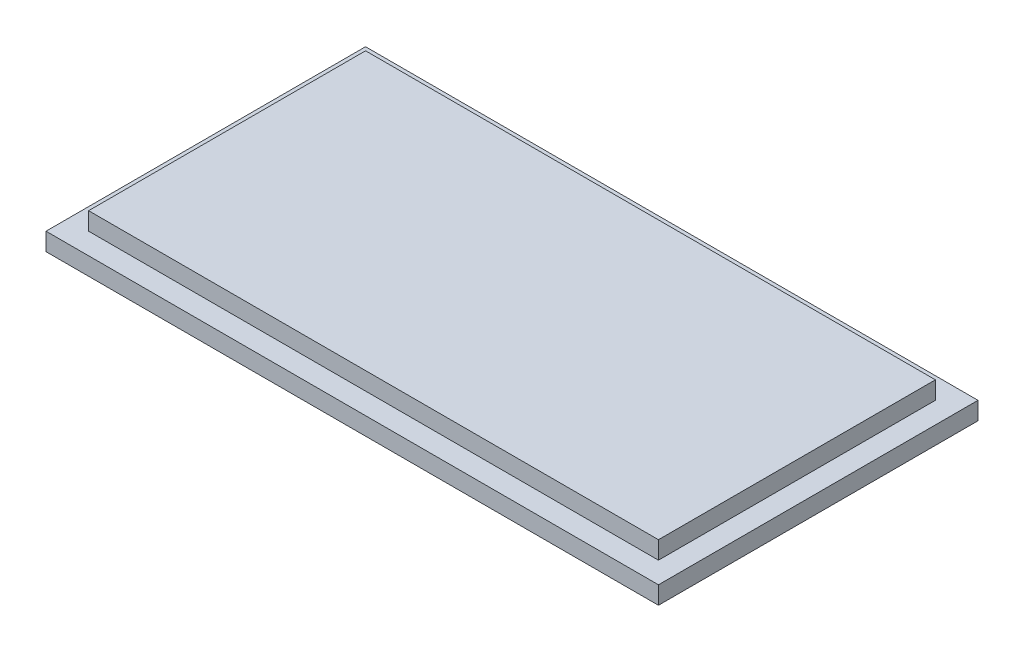
ISO-10303-21;
HEADER;
FILE_DESCRIPTION(('STEP AP214'),'2;1');
FILE_NAME('part.step','',(''),(''),'','','');
FILE_SCHEMA(('AUTOMOTIVE_DESIGN { 1 0 10303 214 1 1 1 1 }'));
ENDSEC;
DATA;
#1=APPLICATION_CONTEXT('core data for automotive mechanical design processes');
#2=APPLICATION_PROTOCOL_DEFINITION('international standard','automotive_design',2000,#1);
#3=PRODUCT_CONTEXT('',#1,'mechanical');
#4=PRODUCT('Part','Part','',(#3));
#5=PRODUCT_RELATED_PRODUCT_CATEGORY('part','',(#4));
#6=PRODUCT_DEFINITION_FORMATION('','',#4);
#7=PRODUCT_DEFINITION_CONTEXT('part definition',#1,'design');
#8=PRODUCT_DEFINITION('design','',#6,#7);
#9=PRODUCT_DEFINITION_SHAPE('','',#8);
#10=(LENGTH_UNIT() NAMED_UNIT(*) SI_UNIT(.MILLI.,.METRE.));
#11=(NAMED_UNIT(*) PLANE_ANGLE_UNIT() SI_UNIT($,.RADIAN.));
#12=(NAMED_UNIT(*) SI_UNIT($,.STERADIAN.) SOLID_ANGLE_UNIT());
#13=UNCERTAINTY_MEASURE_WITH_UNIT(LENGTH_MEASURE(1.E-05),#10,'distance_accuracy_value','');
#14=(GEOMETRIC_REPRESENTATION_CONTEXT(3) GLOBAL_UNCERTAINTY_ASSIGNED_CONTEXT((#13)) GLOBAL_UNIT_ASSIGNED_CONTEXT((#10,
#11,#12)) REPRESENTATION_CONTEXT('',''));
#15=CARTESIAN_POINT('',(0.,0.,0.));
#16=DIRECTION('',(0.,0.,1.));
#17=DIRECTION('',(1.,0.,0.));
#18=AXIS2_PLACEMENT_3D('',#15,#16,#17);
#19=CARTESIAN_POINT('',(17.25,1.,-9.));
#20=DIRECTION('',(-1.,0.,0.));
#21=DIRECTION('',(0.,0.,1.));
#22=AXIS2_PLACEMENT_3D('',#19,#20,#21);
#23=PLANE('',#22);
#24=DIRECTION('',(0.,0.,-1.));
#25=VECTOR('',#24,1.);
#26=CARTESIAN_POINT('',(17.25,0.,-9.));
#27=LINE('',#26,#25);
#28=CARTESIAN_POINT('',(17.25,0.,9.));
#29=VERTEX_POINT('',#28);
#30=CARTESIAN_POINT('',(17.25,0.,-9.));
#31=VERTEX_POINT('',#30);
#32=EDGE_CURVE('E127',#29,#31,#27,.T.);
#33=ORIENTED_EDGE('',*,*,#32,.T.);
#34=DIRECTION('',(0.,-1.,0.));
#35=VECTOR('',#34,1.);
#36=CARTESIAN_POINT('',(17.25,1.,-9.));
#37=LINE('',#36,#35);
#38=CARTESIAN_POINT('',(17.25,1.,-9.));
#39=VERTEX_POINT('',#38);
#40=EDGE_CURVE('E11',#39,#31,#37,.T.);
#41=ORIENTED_EDGE('',*,*,#40,.F.);
#42=DIRECTION('',(0.,0.,-1.));
#43=VECTOR('',#42,1.);
#44=CARTESIAN_POINT('',(17.25,1.,-9.));
#45=LINE('',#44,#43);
#46=CARTESIAN_POINT('',(17.25,1.,9.));
#47=VERTEX_POINT('',#46);
#48=EDGE_CURVE('E138',#47,#39,#45,.T.);
#49=ORIENTED_EDGE('',*,*,#48,.F.);
#50=DIRECTION('',(0.,-1.,0.));
#51=VECTOR('',#50,1.);
#52=CARTESIAN_POINT('',(17.25,1.,9.));
#53=LINE('',#52,#51);
#54=EDGE_CURVE('E151',#47,#29,#53,.T.);
#55=ORIENTED_EDGE('',*,*,#54,.T.);
#56=EDGE_LOOP('',(#33,#41,#49,#55));
#57=FACE_BOUND('',#56,.T.);
#58=ADVANCED_FACE('F39',(#57),#23,.F.);
#59=CARTESIAN_POINT('',(-17.25,1.,-9.));
#60=DIRECTION('',(0.,0.,1.));
#61=DIRECTION('',(1.,0.,0.));
#62=AXIS2_PLACEMENT_3D('',#59,#60,#61);
#63=PLANE('',#62);
#64=DIRECTION('',(-1.,0.,0.));
#65=VECTOR('',#64,1.);
#66=CARTESIAN_POINT('',(-17.25,0.,-9.));
#67=LINE('',#66,#65);
#68=CARTESIAN_POINT('',(-17.25,0.,-9.));
#69=VERTEX_POINT('',#68);
#70=EDGE_CURVE('E132',#31,#69,#67,.T.);
#71=ORIENTED_EDGE('',*,*,#70,.T.);
#72=DIRECTION('',(0.,-1.,0.));
#73=VECTOR('',#72,1.);
#74=CARTESIAN_POINT('',(-17.25,1.,-9.));
#75=LINE('',#74,#73);
#76=CARTESIAN_POINT('',(-17.25,1.,-9.));
#77=VERTEX_POINT('',#76);
#78=EDGE_CURVE('E47',#77,#69,#75,.T.);
#79=ORIENTED_EDGE('',*,*,#78,.F.);
#80=DIRECTION('',(-1.,0.,0.));
#81=VECTOR('',#80,1.);
#82=CARTESIAN_POINT('',(-17.25,1.,-9.));
#83=LINE('',#82,#81);
#84=EDGE_CURVE('E142',#39,#77,#83,.T.);
#85=ORIENTED_EDGE('',*,*,#84,.F.);
#86=ORIENTED_EDGE('',*,*,#40,.T.);
#87=EDGE_LOOP('',(#71,#79,#85,#86));
#88=FACE_BOUND('',#87,.T.);
#89=ADVANCED_FACE('F188',(#88),#63,.F.);
#90=CARTESIAN_POINT('',(-17.25,1.,-9.));
#91=DIRECTION('',(1.,0.,0.));
#92=DIRECTION('',(0.,0.,-1.));
#93=AXIS2_PLACEMENT_3D('',#90,#91,#92);
#94=PLANE('',#93);
#95=DIRECTION('',(0.,0.,1.));
#96=VECTOR('',#95,1.);
#97=CARTESIAN_POINT('',(-17.25,0.,-9.));
#98=LINE('',#97,#96);
#99=CARTESIAN_POINT('',(-17.25,0.,9.));
#100=VERTEX_POINT('',#99);
#101=EDGE_CURVE('E155',#69,#100,#98,.T.);
#102=ORIENTED_EDGE('',*,*,#101,.T.);
#103=DIRECTION('',(0.,-1.,0.));
#104=VECTOR('',#103,1.);
#105=CARTESIAN_POINT('',(-17.25,1.,9.));
#106=LINE('',#105,#104);
#107=CARTESIAN_POINT('',(-17.25,1.,9.));
#108=VERTEX_POINT('',#107);
#109=EDGE_CURVE('E163',#108,#100,#106,.T.);
#110=ORIENTED_EDGE('',*,*,#109,.F.);
#111=DIRECTION('',(0.,0.,1.));
#112=VECTOR('',#111,1.);
#113=CARTESIAN_POINT('',(-17.25,1.,-9.));
#114=LINE('',#113,#112);
#115=EDGE_CURVE('E146',#77,#108,#114,.T.);
#116=ORIENTED_EDGE('',*,*,#115,.F.);
#117=ORIENTED_EDGE('',*,*,#78,.T.);
#118=EDGE_LOOP('',(#102,#110,#116,#117));
#119=FACE_BOUND('',#118,.T.);
#120=ADVANCED_FACE('F172',(#119),#94,.F.);
#121=CARTESIAN_POINT('',(-17.25,1.,9.));
#122=DIRECTION('',(0.,0.,-1.));
#123=DIRECTION('',(-1.,0.,0.));
#124=AXIS2_PLACEMENT_3D('',#121,#122,#123);
#125=PLANE('',#124);
#126=DIRECTION('',(1.,0.,0.));
#127=VECTOR('',#126,1.);
#128=CARTESIAN_POINT('',(-17.25,0.,9.));
#129=LINE('',#128,#127);
#130=EDGE_CURVE('E143',#100,#29,#129,.T.);
#131=ORIENTED_EDGE('',*,*,#130,.T.);
#132=ORIENTED_EDGE('',*,*,#54,.F.);
#133=DIRECTION('',(1.,0.,0.));
#134=VECTOR('',#133,1.);
#135=CARTESIAN_POINT('',(-17.25,1.,9.));
#136=LINE('',#135,#134);
#137=EDGE_CURVE('E149',#108,#47,#136,.T.);
#138=ORIENTED_EDGE('',*,*,#137,.F.);
#139=ORIENTED_EDGE('',*,*,#109,.T.);
#140=EDGE_LOOP('',(#131,#132,#138,#139));
#141=FACE_BOUND('',#140,.T.);
#142=ADVANCED_FACE('F181',(#141),#125,.F.);
#143=CARTESIAN_POINT('',(0.,1.,0.));
#144=DIRECTION('',(0.,1.,0.));
#145=DIRECTION('',(0.,0.,1.));
#146=AXIS2_PLACEMENT_3D('',#143,#144,#145);
#147=PLANE('',#146);
#148=DIRECTION('',(0.,0.,-1.));
#149=VECTOR('',#148,1.);
#150=CARTESIAN_POINT('',(16.05,1.,-7.8));
#151=LINE('',#150,#149);
#152=CARTESIAN_POINT('',(16.05,1.,7.8));
#153=VERTEX_POINT('',#152);
#154=CARTESIAN_POINT('',(16.05,1.,-7.8));
#155=VERTEX_POINT('',#154);
#156=EDGE_CURVE('E54',#153,#155,#151,.T.);
#157=ORIENTED_EDGE('',*,*,#156,.F.);
#158=DIRECTION('',(1.,0.,0.));
#159=VECTOR('',#158,1.);
#160=CARTESIAN_POINT('',(-16.05,1.,7.8));
#161=LINE('',#160,#159);
#162=CARTESIAN_POINT('',(-16.05,1.,7.8));
#163=VERTEX_POINT('',#162);
#164=EDGE_CURVE('E58',#163,#153,#161,.T.);
#165=ORIENTED_EDGE('',*,*,#164,.F.);
#166=DIRECTION('',(0.,0.,1.));
#167=VECTOR('',#166,1.);
#168=CARTESIAN_POINT('',(-16.05,1.,-7.8));
#169=LINE('',#168,#167);
#170=CARTESIAN_POINT('',(-16.05,1.,-7.8));
#171=VERTEX_POINT('',#170);
#172=EDGE_CURVE('E283',#171,#163,#169,.T.);
#173=ORIENTED_EDGE('',*,*,#172,.F.);
#174=DIRECTION('',(-1.,0.,0.));
#175=VECTOR('',#174,1.);
#176=CARTESIAN_POINT('',(-16.05,1.,-7.8));
#177=LINE('',#176,#175);
#178=EDGE_CURVE('E293',#155,#171,#177,.T.);
#179=ORIENTED_EDGE('',*,*,#178,.F.);
#180=EDGE_LOOP('',(#157,#165,#173,#179));
#181=FACE_BOUND('',#180,.T.);
#182=ORIENTED_EDGE('',*,*,#48,.T.);
#183=ORIENTED_EDGE('',*,*,#84,.T.);
#184=ORIENTED_EDGE('',*,*,#115,.T.);
#185=ORIENTED_EDGE('',*,*,#137,.T.);
#186=EDGE_LOOP('',(#182,#183,#184,#185));
#187=FACE_BOUND('',#186,.T.);
#188=ADVANCED_FACE('F187',(#181,#187),#147,.T.);
#189=CARTESIAN_POINT('',(0.,0.,0.));
#190=DIRECTION('',(0.,1.,0.));
#191=DIRECTION('',(0.,0.,1.));
#192=AXIS2_PLACEMENT_3D('',#189,#190,#191);
#193=PLANE('',#192);
#194=ORIENTED_EDGE('',*,*,#32,.F.);
#195=ORIENTED_EDGE('',*,*,#130,.F.);
#196=ORIENTED_EDGE('',*,*,#101,.F.);
#197=ORIENTED_EDGE('',*,*,#70,.F.);
#198=EDGE_LOOP('',(#194,#195,#196,#197));
#199=FACE_BOUND('',#198,.T.);
#200=ADVANCED_FACE('F178',(#199),#193,.F.);
#201=CARTESIAN_POINT('',(16.05,2.,-7.8));
#202=DIRECTION('',(-1.,0.,0.));
#203=DIRECTION('',(0.,0.,1.));
#204=AXIS2_PLACEMENT_3D('',#201,#202,#203);
#205=PLANE('',#204);
#206=ORIENTED_EDGE('',*,*,#156,.T.);
#207=DIRECTION('',(0.,-1.,0.));
#208=VECTOR('',#207,1.);
#209=CARTESIAN_POINT('',(16.05,2.,-7.8));
#210=LINE('',#209,#208);
#211=CARTESIAN_POINT('',(16.05,2.,-7.8));
#212=VERTEX_POINT('',#211);
#213=EDGE_CURVE('E107',#212,#155,#210,.T.);
#214=ORIENTED_EDGE('',*,*,#213,.F.);
#215=DIRECTION('',(0.,0.,-1.));
#216=VECTOR('',#215,1.);
#217=CARTESIAN_POINT('',(16.05,2.,-7.8));
#218=LINE('',#217,#216);
#219=CARTESIAN_POINT('',(16.05,2.,7.8));
#220=VERTEX_POINT('',#219);
#221=EDGE_CURVE('E114',#220,#212,#218,.T.);
#222=ORIENTED_EDGE('',*,*,#221,.F.);
#223=DIRECTION('',(0.,-1.,0.));
#224=VECTOR('',#223,1.);
#225=CARTESIAN_POINT('',(16.05,2.,7.8));
#226=LINE('',#225,#224);
#227=EDGE_CURVE('E280',#220,#153,#226,.T.);
#228=ORIENTED_EDGE('',*,*,#227,.T.);
#229=EDGE_LOOP('',(#206,#214,#222,#228));
#230=FACE_BOUND('',#229,.T.);
#231=ADVANCED_FACE('F125',(#230),#205,.F.);
#232=CARTESIAN_POINT('',(-16.05,2.,-7.8));
#233=DIRECTION('',(0.,0.,1.));
#234=DIRECTION('',(1.,0.,0.));
#235=AXIS2_PLACEMENT_3D('',#232,#233,#234);
#236=PLANE('',#235);
#237=ORIENTED_EDGE('',*,*,#178,.T.);
#238=DIRECTION('',(0.,-1.,0.));
#239=VECTOR('',#238,1.);
#240=CARTESIAN_POINT('',(-16.05,2.,-7.8));
#241=LINE('',#240,#239);
#242=CARTESIAN_POINT('',(-16.05,2.,-7.8));
#243=VERTEX_POINT('',#242);
#244=EDGE_CURVE('E109',#243,#171,#241,.T.);
#245=ORIENTED_EDGE('',*,*,#244,.F.);
#246=DIRECTION('',(-1.,0.,0.));
#247=VECTOR('',#246,1.);
#248=CARTESIAN_POINT('',(-16.05,2.,-7.8));
#249=LINE('',#248,#247);
#250=EDGE_CURVE('E102',#212,#243,#249,.T.);
#251=ORIENTED_EDGE('',*,*,#250,.F.);
#252=ORIENTED_EDGE('',*,*,#213,.T.);
#253=EDGE_LOOP('',(#237,#245,#251,#252));
#254=FACE_BOUND('',#253,.T.);
#255=ADVANCED_FACE('F105',(#254),#236,.F.);
#256=CARTESIAN_POINT('',(-16.05,2.,-7.8));
#257=DIRECTION('',(1.,0.,0.));
#258=DIRECTION('',(0.,0.,-1.));
#259=AXIS2_PLACEMENT_3D('',#256,#257,#258);
#260=PLANE('',#259);
#261=ORIENTED_EDGE('',*,*,#172,.T.);
#262=DIRECTION('',(0.,-1.,0.));
#263=VECTOR('',#262,1.);
#264=CARTESIAN_POINT('',(-16.05,2.,7.8));
#265=LINE('',#264,#263);
#266=CARTESIAN_POINT('',(-16.05,2.,7.8));
#267=VERTEX_POINT('',#266);
#268=EDGE_CURVE('E134',#267,#163,#265,.T.);
#269=ORIENTED_EDGE('',*,*,#268,.F.);
#270=DIRECTION('',(0.,0.,1.));
#271=VECTOR('',#270,1.);
#272=CARTESIAN_POINT('',(-16.05,2.,-7.8));
#273=LINE('',#272,#271);
#274=EDGE_CURVE('E113',#243,#267,#273,.T.);
#275=ORIENTED_EDGE('',*,*,#274,.F.);
#276=ORIENTED_EDGE('',*,*,#244,.T.);
#277=EDGE_LOOP('',(#261,#269,#275,#276));
#278=FACE_BOUND('',#277,.T.);
#279=ADVANCED_FACE('F206',(#278),#260,.F.);
#280=CARTESIAN_POINT('',(-16.05,2.,7.8));
#281=DIRECTION('',(0.,0.,-1.));
#282=DIRECTION('',(-1.,0.,0.));
#283=AXIS2_PLACEMENT_3D('',#280,#281,#282);
#284=PLANE('',#283);
#285=ORIENTED_EDGE('',*,*,#164,.T.);
#286=ORIENTED_EDGE('',*,*,#227,.F.);
#287=DIRECTION('',(1.,0.,0.));
#288=VECTOR('',#287,1.);
#289=CARTESIAN_POINT('',(-16.05,2.,7.8));
#290=LINE('',#289,#288);
#291=EDGE_CURVE('E119',#267,#220,#290,.T.);
#292=ORIENTED_EDGE('',*,*,#291,.F.);
#293=ORIENTED_EDGE('',*,*,#268,.T.);
#294=EDGE_LOOP('',(#285,#286,#292,#293));
#295=FACE_BOUND('',#294,.T.);
#296=ADVANCED_FACE('F209',(#295),#284,.F.);
#297=CARTESIAN_POINT('',(0.,2.,0.));
#298=DIRECTION('',(0.,1.,0.));
#299=DIRECTION('',(0.,0.,1.));
#300=AXIS2_PLACEMENT_3D('',#297,#298,#299);
#301=PLANE('',#300);
#302=ORIENTED_EDGE('',*,*,#221,.T.);
#303=ORIENTED_EDGE('',*,*,#250,.T.);
#304=ORIENTED_EDGE('',*,*,#274,.T.);
#305=ORIENTED_EDGE('',*,*,#291,.T.);
#306=EDGE_LOOP('',(#302,#303,#304,#305));
#307=FACE_BOUND('',#306,.T.);
#308=ADVANCED_FACE('F117',(#307),#301,.T.);
#309=CLOSED_SHELL('',(#58,#89,#120,#142,#188,#200,#231,#255,#279,#296,#308));
#310=MANIFOLD_SOLID_BREP('B2',#309);
#311=ADVANCED_BREP_SHAPE_REPRESENTATION('',(#18,#310),#14);
#312=SHAPE_DEFINITION_REPRESENTATION(#9,#311);
ENDSEC;
END-ISO-10303-21;
